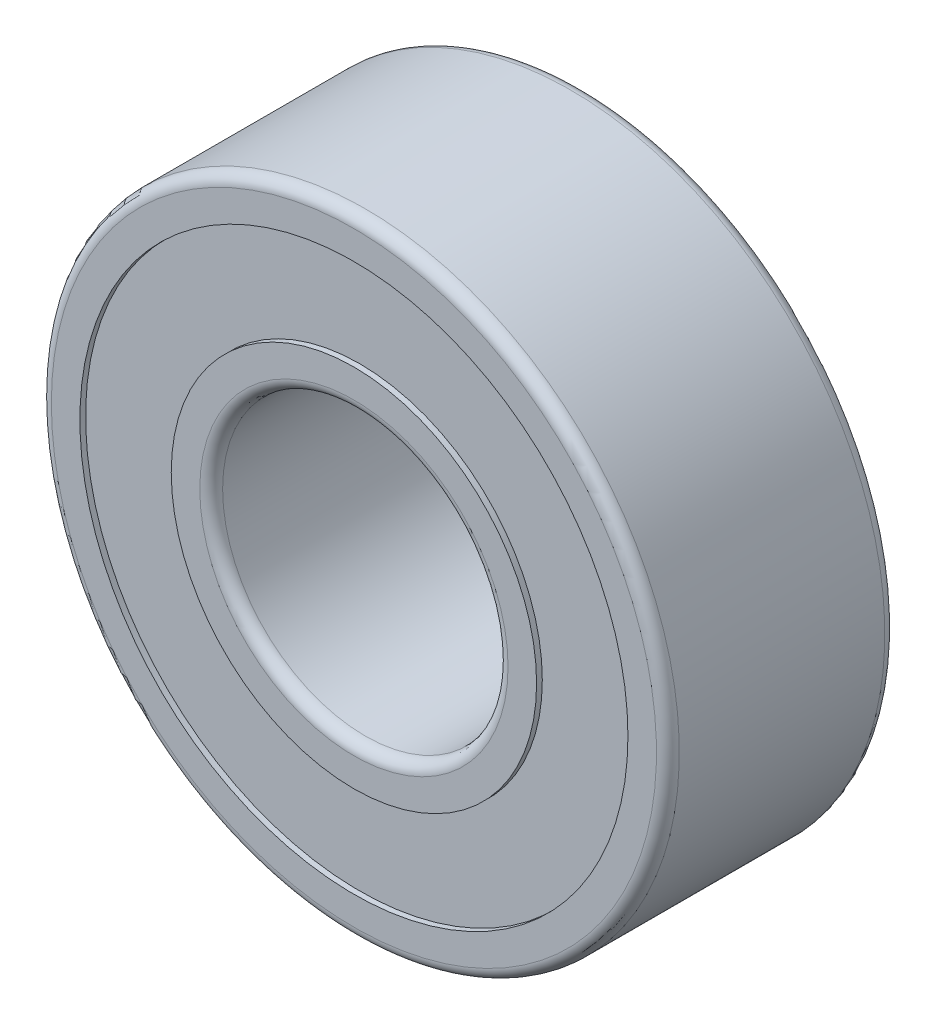
ISO-10303-21;
HEADER;
FILE_DESCRIPTION(('STEP AP214'),'2;1');
FILE_NAME('part.step','',(''),(''),'','','');
FILE_SCHEMA(('AUTOMOTIVE_DESIGN { 1 0 10303 214 1 1 1 1 }'));
ENDSEC;
DATA;
#1=APPLICATION_CONTEXT('core data for automotive mechanical design processes');
#2=APPLICATION_PROTOCOL_DEFINITION('international standard','automotive_design',2000,#1);
#3=PRODUCT_CONTEXT('',#1,'mechanical');
#4=PRODUCT('Part','Part','',(#3));
#5=PRODUCT_RELATED_PRODUCT_CATEGORY('part','',(#4));
#6=PRODUCT_DEFINITION_FORMATION('','',#4);
#7=PRODUCT_DEFINITION_CONTEXT('part definition',#1,'design');
#8=PRODUCT_DEFINITION('design','',#6,#7);
#9=PRODUCT_DEFINITION_SHAPE('','',#8);
#10=(LENGTH_UNIT() NAMED_UNIT(*) SI_UNIT(.MILLI.,.METRE.));
#11=(NAMED_UNIT(*) PLANE_ANGLE_UNIT() SI_UNIT($,.RADIAN.));
#12=(NAMED_UNIT(*) SI_UNIT($,.STERADIAN.) SOLID_ANGLE_UNIT());
#13=UNCERTAINTY_MEASURE_WITH_UNIT(LENGTH_MEASURE(1.E-05),#10,'distance_accuracy_value','');
#14=(GEOMETRIC_REPRESENTATION_CONTEXT(3) GLOBAL_UNCERTAINTY_ASSIGNED_CONTEXT((#13)) GLOBAL_UNIT_ASSIGNED_CONTEXT((#10,
#11,#12)) REPRESENTATION_CONTEXT('',''));
#15=CARTESIAN_POINT('',(0.,0.,0.));
#16=DIRECTION('',(0.,0.,1.));
#17=DIRECTION('',(1.,0.,0.));
#18=AXIS2_PLACEMENT_3D('',#15,#16,#17);
#19=CARTESIAN_POINT('',(0.,0.,3.8));
#20=DIRECTION('',(0.,0.,1.));
#21=DIRECTION('',(1.,0.,0.));
#22=AXIS2_PLACEMENT_3D('',#19,#20,#21);
#23=TOROIDAL_SURFACE('',#22,5.3,0.2);
#24=CARTESIAN_POINT('',(0.,0.,4.));
#25=DIRECTION('',(0.,0.,-1.));
#26=DIRECTION('',(1.,0.,0.));
#27=AXIS2_PLACEMENT_3D('',#24,#25,#26);
#28=CIRCLE('',#27,5.3);
#29=CARTESIAN_POINT('',(-5.3,0.,4.));
#30=VERTEX_POINT('',#29);
#31=EDGE_CURVE('E177',#30,#30,#28,.T.);
#32=ORIENTED_EDGE('',*,*,#31,.T.);
#33=CARTESIAN_POINT('',(-5.3,0.,3.8));
#34=DIRECTION('',(0.,-1.,0.));
#35=DIRECTION('',(-1.,0.,0.));
#36=AXIS2_PLACEMENT_3D('',#33,#34,#35);
#37=CIRCLE('',#36,0.2);
#38=CARTESIAN_POINT('',(-5.5,0.,3.8));
#39=VERTEX_POINT('',#38);
#40=EDGE_CURVE('E10',#30,#39,#37,.T.);
#41=ORIENTED_EDGE('',*,*,#40,.T.);
#42=CARTESIAN_POINT('',(0.,0.,3.8));
#43=DIRECTION('',(0.,0.,1.));
#44=DIRECTION('',(1.,0.,0.));
#45=AXIS2_PLACEMENT_3D('',#42,#43,#44);
#46=CIRCLE('',#45,5.5);
#47=EDGE_CURVE('E158',#39,#39,#46,.T.);
#48=ORIENTED_EDGE('',*,*,#47,.T.);
#49=ORIENTED_EDGE('',*,*,#40,.F.);
#50=EDGE_LOOP('',(#32,#41,#48,#49));
#51=FACE_BOUND('',#50,.T.);
#52=ADVANCED_FACE('F16',(#51),#23,.T.);
#53=CARTESIAN_POINT('',(0.,0.,0.));
#54=DIRECTION('',(0.,0.,1.));
#55=DIRECTION('',(1.,0.,0.));
#56=AXIS2_PLACEMENT_3D('',#53,#54,#55);
#57=CYLINDRICAL_SURFACE('',#56,5.5);
#58=ORIENTED_EDGE('',*,*,#47,.F.);
#59=DIRECTION('',(0.,0.,-1.));
#60=VECTOR('',#59,1.);
#61=CARTESIAN_POINT('',(-5.5,0.,0.));
#62=LINE('',#61,#60);
#63=CARTESIAN_POINT('',(-5.5,0.,0.2));
#64=VERTEX_POINT('',#63);
#65=EDGE_CURVE('E27',#39,#64,#62,.T.);
#66=ORIENTED_EDGE('',*,*,#65,.T.);
#67=CARTESIAN_POINT('',(0.,0.,0.2));
#68=DIRECTION('',(0.,0.,-1.));
#69=DIRECTION('',(1.,0.,0.));
#70=AXIS2_PLACEMENT_3D('',#67,#68,#69);
#71=CIRCLE('',#70,5.5);
#72=EDGE_CURVE('E20',#64,#64,#71,.T.);
#73=ORIENTED_EDGE('',*,*,#72,.F.);
#74=ORIENTED_EDGE('',*,*,#65,.F.);
#75=EDGE_LOOP('',(#58,#66,#73,#74));
#76=FACE_BOUND('',#75,.T.);
#77=ADVANCED_FACE('F230',(#76),#57,.T.);
#78=CARTESIAN_POINT('',(0.,0.,0.2));
#79=DIRECTION('',(0.,0.,1.));
#80=DIRECTION('',(1.,0.,0.));
#81=AXIS2_PLACEMENT_3D('',#78,#79,#80);
#82=TOROIDAL_SURFACE('',#81,5.3,0.2);
#83=ORIENTED_EDGE('',*,*,#72,.T.);
#84=CARTESIAN_POINT('',(-5.3,0.,0.2));
#85=DIRECTION('',(0.,-1.,0.));
#86=DIRECTION('',(-1.,0.,0.));
#87=AXIS2_PLACEMENT_3D('',#84,#85,#86);
#88=CIRCLE('',#87,0.2);
#89=CARTESIAN_POINT('',(-5.3,0.,0.));
#90=VERTEX_POINT('',#89);
#91=EDGE_CURVE('E170',#64,#90,#88,.T.);
#92=ORIENTED_EDGE('',*,*,#91,.T.);
#93=CARTESIAN_POINT('',(0.,0.,0.));
#94=DIRECTION('',(0.,0.,1.));
#95=DIRECTION('',(1.,0.,0.));
#96=AXIS2_PLACEMENT_3D('',#93,#94,#95);
#97=CIRCLE('',#96,5.3);
#98=EDGE_CURVE('E150',#90,#90,#97,.T.);
#99=ORIENTED_EDGE('',*,*,#98,.T.);
#100=ORIENTED_EDGE('',*,*,#91,.F.);
#101=EDGE_LOOP('',(#83,#92,#99,#100));
#102=FACE_BOUND('',#101,.T.);
#103=ADVANCED_FACE('F235',(#102),#82,.T.);
#104=CARTESIAN_POINT('',(0.,0.,4.));
#105=DIRECTION('',(0.,0.,1.));
#106=DIRECTION('',(1.,0.,0.));
#107=AXIS2_PLACEMENT_3D('',#104,#105,#106);
#108=PLANE('',#107);
#109=CARTESIAN_POINT('',(0.,0.,4.));
#110=DIRECTION('',(0.,0.,1.));
#111=DIRECTION('',(1.,0.,0.));
#112=AXIS2_PLACEMENT_3D('',#109,#110,#111);
#113=CIRCLE('',#112,2.7);
#114=CARTESIAN_POINT('',(2.7,0.,4.));
#115=VERTEX_POINT('',#114);
#116=EDGE_CURVE('E161',#115,#115,#113,.T.);
#117=ORIENTED_EDGE('',*,*,#116,.F.);
#118=EDGE_LOOP('',(#117));
#119=FACE_BOUND('',#118,.T.);
#120=CARTESIAN_POINT('',(0.,0.,4.));
#121=DIRECTION('',(0.,0.,1.));
#122=DIRECTION('',(-1.,0.,0.));
#123=AXIS2_PLACEMENT_3D('',#120,#121,#122);
#124=CIRCLE('',#123,3.2);
#125=CARTESIAN_POINT('',(3.2,0.,4.));
#126=VERTEX_POINT('',#125);
#127=EDGE_CURVE('E154',#126,#126,#124,.T.);
#128=ORIENTED_EDGE('',*,*,#127,.T.);
#129=EDGE_LOOP('',(#128));
#130=FACE_BOUND('',#129,.T.);
#131=ADVANCED_FACE('F216',(#119,#130),#108,.T.);
#132=CARTESIAN_POINT('',(0.,0.,3.8));
#133=DIRECTION('',(0.,0.,-1.));
#134=DIRECTION('',(-1.,0.,0.));
#135=AXIS2_PLACEMENT_3D('',#132,#133,#134);
#136=TOROIDAL_SURFACE('',#135,2.7,0.2);
#137=ORIENTED_EDGE('',*,*,#116,.T.);
#138=CARTESIAN_POINT('',(2.7,0.,3.8));
#139=DIRECTION('',(0.,-1.,0.));
#140=DIRECTION('',(1.,0.,0.));
#141=AXIS2_PLACEMENT_3D('',#138,#139,#140);
#142=CIRCLE('',#141,0.2);
#143=CARTESIAN_POINT('',(2.5,0.,3.8));
#144=VERTEX_POINT('',#143);
#145=EDGE_CURVE('E165',#115,#144,#142,.T.);
#146=ORIENTED_EDGE('',*,*,#145,.T.);
#147=CARTESIAN_POINT('',(0.,0.,3.8));
#148=DIRECTION('',(0.,0.,-1.));
#149=DIRECTION('',(1.,0.,0.));
#150=AXIS2_PLACEMENT_3D('',#147,#148,#149);
#151=CIRCLE('',#150,2.5);
#152=CARTESIAN_POINT('',(-2.5,0.,3.8));
#153=VERTEX_POINT('',#152);
#154=EDGE_CURVE('E148',#144,#153,#151,.T.);
#155=ORIENTED_EDGE('',*,*,#154,.T.);
#156=CARTESIAN_POINT('',(0.,0.,3.8));
#157=DIRECTION('',(0.,0.,-1.));
#158=DIRECTION('',(1.,0.,0.));
#159=AXIS2_PLACEMENT_3D('',#156,#157,#158);
#160=CIRCLE('',#159,2.5);
#161=EDGE_CURVE('E149',#153,#144,#160,.T.);
#162=ORIENTED_EDGE('',*,*,#161,.T.);
#163=ORIENTED_EDGE('',*,*,#145,.F.);
#164=EDGE_LOOP('',(#137,#146,#155,#162,#163));
#165=FACE_BOUND('',#164,.T.);
#166=ADVANCED_FACE('F245',(#165),#136,.T.);
#167=CARTESIAN_POINT('',(0.,0.,0.));
#168=DIRECTION('',(0.,0.,1.));
#169=DIRECTION('',(1.,0.,0.));
#170=AXIS2_PLACEMENT_3D('',#167,#168,#169);
#171=PLANE('',#170);
#172=CARTESIAN_POINT('',(0.,0.,0.));
#173=DIRECTION('',(0.,0.,-1.));
#174=DIRECTION('',(1.,0.,0.));
#175=AXIS2_PLACEMENT_3D('',#172,#173,#174);
#176=CIRCLE('',#175,2.7);
#177=CARTESIAN_POINT('',(2.7,0.,0.));
#178=VERTEX_POINT('',#177);
#179=EDGE_CURVE('E187',#178,#178,#176,.T.);
#180=ORIENTED_EDGE('',*,*,#179,.F.);
#181=EDGE_LOOP('',(#180));
#182=FACE_BOUND('',#181,.T.);
#183=CARTESIAN_POINT('',(0.,0.,0.));
#184=DIRECTION('',(0.,0.,-1.));
#185=DIRECTION('',(1.,0.,0.));
#186=AXIS2_PLACEMENT_3D('',#183,#184,#185);
#187=CIRCLE('',#186,3.2);
#188=CARTESIAN_POINT('',(-3.2,0.,0.));
#189=VERTEX_POINT('',#188);
#190=EDGE_CURVE('E119',#189,#189,#187,.T.);
#191=ORIENTED_EDGE('',*,*,#190,.T.);
#192=EDGE_LOOP('',(#191));
#193=FACE_BOUND('',#192,.T.);
#194=ADVANCED_FACE('F242',(#182,#193),#171,.F.);
#195=CARTESIAN_POINT('',(0.,0.,0.));
#196=DIRECTION('',(0.,0.,1.));
#197=DIRECTION('',(1.,0.,0.));
#198=AXIS2_PLACEMENT_3D('',#195,#196,#197);
#199=CYLINDRICAL_SURFACE('',#198,2.5);
#200=ORIENTED_EDGE('',*,*,#161,.F.);
#201=DIRECTION('',(0.,0.,-1.));
#202=VECTOR('',#201,1.);
#203=CARTESIAN_POINT('',(-2.5,0.,0.));
#204=LINE('',#203,#202);
#205=CARTESIAN_POINT('',(-2.5,0.,0.2));
#206=VERTEX_POINT('',#205);
#207=EDGE_CURVE('E145',#153,#206,#204,.T.);
#208=ORIENTED_EDGE('',*,*,#207,.T.);
#209=CARTESIAN_POINT('',(0.,0.,0.2));
#210=DIRECTION('',(0.,0.,1.));
#211=DIRECTION('',(1.,0.,0.));
#212=AXIS2_PLACEMENT_3D('',#209,#210,#211);
#213=CIRCLE('',#212,2.5);
#214=CARTESIAN_POINT('',(2.5,0.,0.2));
#215=VERTEX_POINT('',#214);
#216=EDGE_CURVE('E173',#215,#206,#213,.T.);
#217=ORIENTED_EDGE('',*,*,#216,.F.);
#218=CARTESIAN_POINT('',(0.,0.,0.2));
#219=DIRECTION('',(0.,0.,1.));
#220=DIRECTION('',(1.,0.,0.));
#221=AXIS2_PLACEMENT_3D('',#218,#219,#220);
#222=CIRCLE('',#221,2.5);
#223=EDGE_CURVE('E188',#206,#215,#222,.T.);
#224=ORIENTED_EDGE('',*,*,#223,.F.);
#225=ORIENTED_EDGE('',*,*,#207,.F.);
#226=ORIENTED_EDGE('',*,*,#154,.F.);
#227=EDGE_LOOP('',(#200,#208,#217,#224,#225,#226));
#228=FACE_BOUND('',#227,.T.);
#229=ADVANCED_FACE('F240',(#228),#199,.F.);
#230=CARTESIAN_POINT('',(0.,0.,0.2));
#231=DIRECTION('',(0.,0.,-1.));
#232=DIRECTION('',(-1.,0.,0.));
#233=AXIS2_PLACEMENT_3D('',#230,#231,#232);
#234=TOROIDAL_SURFACE('',#233,2.7,0.2);
#235=ORIENTED_EDGE('',*,*,#223,.T.);
#236=CARTESIAN_POINT('',(2.7,0.,0.2));
#237=DIRECTION('',(0.,-1.,0.));
#238=DIRECTION('',(1.,0.,0.));
#239=AXIS2_PLACEMENT_3D('',#236,#237,#238);
#240=CIRCLE('',#239,0.2);
#241=EDGE_CURVE('E183',#215,#178,#240,.T.);
#242=ORIENTED_EDGE('',*,*,#241,.T.);
#243=ORIENTED_EDGE('',*,*,#179,.T.);
#244=ORIENTED_EDGE('',*,*,#241,.F.);
#245=ORIENTED_EDGE('',*,*,#216,.T.);
#246=EDGE_LOOP('',(#235,#242,#243,#244,#245));
#247=FACE_BOUND('',#246,.T.);
#248=ADVANCED_FACE('F259',(#247),#234,.T.);
#249=CARTESIAN_POINT('',(0.,0.,4.));
#250=DIRECTION('',(0.,0.,1.));
#251=DIRECTION('',(1.,0.,0.));
#252=AXIS2_PLACEMENT_3D('',#249,#250,#251);
#253=PLANE('',#252);
#254=CARTESIAN_POINT('',(0.,0.,4.));
#255=DIRECTION('',(0.,0.,-1.));
#256=DIRECTION('',(-1.,0.,0.));
#257=AXIS2_PLACEMENT_3D('',#254,#255,#256);
#258=CIRCLE('',#257,4.8);
#259=CARTESIAN_POINT('',(4.8,0.,4.));
#260=VERTEX_POINT('',#259);
#261=EDGE_CURVE('E144',#260,#260,#258,.T.);
#262=ORIENTED_EDGE('',*,*,#261,.T.);
#263=EDGE_LOOP('',(#262));
#264=FACE_BOUND('',#263,.T.);
#265=ORIENTED_EDGE('',*,*,#31,.F.);
#266=EDGE_LOOP('',(#265));
#267=FACE_BOUND('',#266,.T.);
#268=ADVANCED_FACE('F256',(#264,#267),#253,.T.);
#269=CARTESIAN_POINT('',(0.,0.,3.9));
#270=DIRECTION('',(0.,0.,1.));
#271=DIRECTION('',(1.,0.,0.));
#272=AXIS2_PLACEMENT_3D('',#269,#270,#271);
#273=PLANE('',#272);
#274=CARTESIAN_POINT('',(0.,0.,3.9));
#275=DIRECTION('',(0.,0.,1.));
#276=DIRECTION('',(-1.,0.,0.));
#277=AXIS2_PLACEMENT_3D('',#274,#275,#276);
#278=CIRCLE('',#277,3.2);
#279=CARTESIAN_POINT('',(3.2,0.,3.9));
#280=VERTEX_POINT('',#279);
#281=EDGE_CURVE('E99',#280,#280,#278,.T.);
#282=ORIENTED_EDGE('',*,*,#281,.F.);
#283=EDGE_LOOP('',(#282));
#284=FACE_BOUND('',#283,.T.);
#285=CARTESIAN_POINT('',(0.,0.,3.9));
#286=DIRECTION('',(0.,0.,-1.));
#287=DIRECTION('',(-1.,0.,0.));
#288=AXIS2_PLACEMENT_3D('',#285,#286,#287);
#289=CIRCLE('',#288,4.8);
#290=CARTESIAN_POINT('',(4.8,0.,3.9));
#291=VERTEX_POINT('',#290);
#292=EDGE_CURVE('E80',#291,#291,#289,.T.);
#293=ORIENTED_EDGE('',*,*,#292,.F.);
#294=EDGE_LOOP('',(#293));
#295=FACE_BOUND('',#294,.T.);
#296=ADVANCED_FACE('F227',(#284,#295),#273,.T.);
#297=CARTESIAN_POINT('',(0.,0.,4.));
#298=DIRECTION('',(0.,0.,-1.));
#299=DIRECTION('',(-1.,0.,0.));
#300=AXIS2_PLACEMENT_3D('',#297,#298,#299);
#301=CYLINDRICAL_SURFACE('',#300,4.8);
#302=ORIENTED_EDGE('',*,*,#261,.F.);
#303=DIRECTION('',(0.,0.,-1.));
#304=VECTOR('',#303,1.);
#305=CARTESIAN_POINT('',(4.8,0.,4.));
#306=LINE('',#305,#304);
#307=EDGE_CURVE('E87',#260,#291,#306,.T.);
#308=ORIENTED_EDGE('',*,*,#307,.T.);
#309=ORIENTED_EDGE('',*,*,#292,.T.);
#310=ORIENTED_EDGE('',*,*,#307,.F.);
#311=EDGE_LOOP('',(#302,#308,#309,#310));
#312=FACE_BOUND('',#311,.T.);
#313=ADVANCED_FACE('F18',(#312),#301,.F.);
#314=CARTESIAN_POINT('',(0.,0.,4.));
#315=DIRECTION('',(0.,0.,-1.));
#316=DIRECTION('',(-1.,0.,0.));
#317=AXIS2_PLACEMENT_3D('',#314,#315,#316);
#318=CYLINDRICAL_SURFACE('',#317,3.2);
#319=ORIENTED_EDGE('',*,*,#127,.F.);
#320=DIRECTION('',(0.,0.,-1.));
#321=VECTOR('',#320,1.);
#322=CARTESIAN_POINT('',(3.2,0.,4.));
#323=LINE('',#322,#321);
#324=EDGE_CURVE('E180',#126,#280,#323,.T.);
#325=ORIENTED_EDGE('',*,*,#324,.T.);
#326=ORIENTED_EDGE('',*,*,#281,.T.);
#327=ORIENTED_EDGE('',*,*,#324,.F.);
#328=EDGE_LOOP('',(#319,#325,#326,#327));
#329=FACE_BOUND('',#328,.T.);
#330=ADVANCED_FACE('F217',(#329),#318,.T.);
#331=CARTESIAN_POINT('',(0.,0.,0.));
#332=DIRECTION('',(0.,0.,1.));
#333=DIRECTION('',(1.,0.,0.));
#334=AXIS2_PLACEMENT_3D('',#331,#332,#333);
#335=PLANE('',#334);
#336=CARTESIAN_POINT('',(0.,0.,0.));
#337=DIRECTION('',(0.,0.,1.));
#338=DIRECTION('',(1.,0.,0.));
#339=AXIS2_PLACEMENT_3D('',#336,#337,#338);
#340=CIRCLE('',#339,4.8);
#341=CARTESIAN_POINT('',(-4.8,0.,0.));
#342=VERTEX_POINT('',#341);
#343=EDGE_CURVE('E155',#342,#342,#340,.T.);
#344=ORIENTED_EDGE('',*,*,#343,.T.);
#345=EDGE_LOOP('',(#344));
#346=FACE_BOUND('',#345,.T.);
#347=ORIENTED_EDGE('',*,*,#98,.F.);
#348=EDGE_LOOP('',(#347));
#349=FACE_BOUND('',#348,.T.);
#350=ADVANCED_FACE('F219',(#346,#349),#335,.F.);
#351=CARTESIAN_POINT('',(0.,0.,-0.1));
#352=DIRECTION('',(0.,0.,-1.));
#353=DIRECTION('',(0.,-1.,0.));
#354=AXIS2_PLACEMENT_3D('',#351,#352,#353);
#355=PLANE('',#354);
#356=CARTESIAN_POINT('',(0.,0.,-0.1));
#357=DIRECTION('',(0.,0.,1.));
#358=DIRECTION('',(1.,0.,0.));
#359=AXIS2_PLACEMENT_3D('',#356,#357,#358);
#360=CIRCLE('',#359,3.2);
#361=CARTESIAN_POINT('',(-3.2,0.,-0.1));
#362=VERTEX_POINT('',#361);
#363=EDGE_CURVE('E128',#362,#362,#360,.T.);
#364=ORIENTED_EDGE('',*,*,#363,.T.);
#365=EDGE_LOOP('',(#364));
#366=FACE_BOUND('',#365,.T.);
#367=CARTESIAN_POINT('',(0.,0.,-0.1));
#368=DIRECTION('',(0.,0.,-1.));
#369=DIRECTION('',(1.,0.,0.));
#370=AXIS2_PLACEMENT_3D('',#367,#368,#369);
#371=CIRCLE('',#370,4.8);
#372=CARTESIAN_POINT('',(-4.8,0.,-0.1));
#373=VERTEX_POINT('',#372);
#374=EDGE_CURVE('E197',#373,#373,#371,.T.);
#375=ORIENTED_EDGE('',*,*,#374,.T.);
#376=EDGE_LOOP('',(#375));
#377=FACE_BOUND('',#376,.T.);
#378=ADVANCED_FACE('F132',(#366,#377),#355,.T.);
#379=CARTESIAN_POINT('',(0.,0.,0.));
#380=DIRECTION('',(0.,0.,-1.));
#381=DIRECTION('',(1.,0.,0.));
#382=AXIS2_PLACEMENT_3D('',#379,#380,#381);
#383=CYLINDRICAL_SURFACE('',#382,4.8);
#384=ORIENTED_EDGE('',*,*,#374,.F.);
#385=DIRECTION('',(0.,0.,1.));
#386=VECTOR('',#385,1.);
#387=CARTESIAN_POINT('',(-4.8,0.,0.));
#388=LINE('',#387,#386);
#389=EDGE_CURVE('E193',#373,#342,#388,.T.);
#390=ORIENTED_EDGE('',*,*,#389,.T.);
#391=ORIENTED_EDGE('',*,*,#343,.F.);
#392=ORIENTED_EDGE('',*,*,#389,.F.);
#393=EDGE_LOOP('',(#384,#390,#391,#392));
#394=FACE_BOUND('',#393,.T.);
#395=ADVANCED_FACE('F247',(#394),#383,.T.);
#396=CARTESIAN_POINT('',(0.,0.,0.));
#397=DIRECTION('',(0.,0.,-1.));
#398=DIRECTION('',(1.,0.,0.));
#399=AXIS2_PLACEMENT_3D('',#396,#397,#398);
#400=CYLINDRICAL_SURFACE('',#399,3.2);
#401=ORIENTED_EDGE('',*,*,#363,.F.);
#402=DIRECTION('',(0.,0.,1.));
#403=VECTOR('',#402,1.);
#404=CARTESIAN_POINT('',(-3.2,0.,0.));
#405=LINE('',#404,#403);
#406=EDGE_CURVE('E125',#362,#189,#405,.T.);
#407=ORIENTED_EDGE('',*,*,#406,.T.);
#408=ORIENTED_EDGE('',*,*,#190,.F.);
#409=ORIENTED_EDGE('',*,*,#406,.F.);
#410=EDGE_LOOP('',(#401,#407,#408,#409));
#411=FACE_BOUND('',#410,.T.);
#412=ADVANCED_FACE('F127',(#411),#400,.F.);
#413=CLOSED_SHELL('',(#52,#77,#103,#131,#166,#194,#229,#248,#268,#296,#313,#330,#350,#378,#395,#412));
#414=MANIFOLD_SOLID_BREP('B1',#413);
#415=ADVANCED_BREP_SHAPE_REPRESENTATION('',(#18,#414),#14);
#416=SHAPE_DEFINITION_REPRESENTATION(#9,#415);
ENDSEC;
END-ISO-10303-21;
